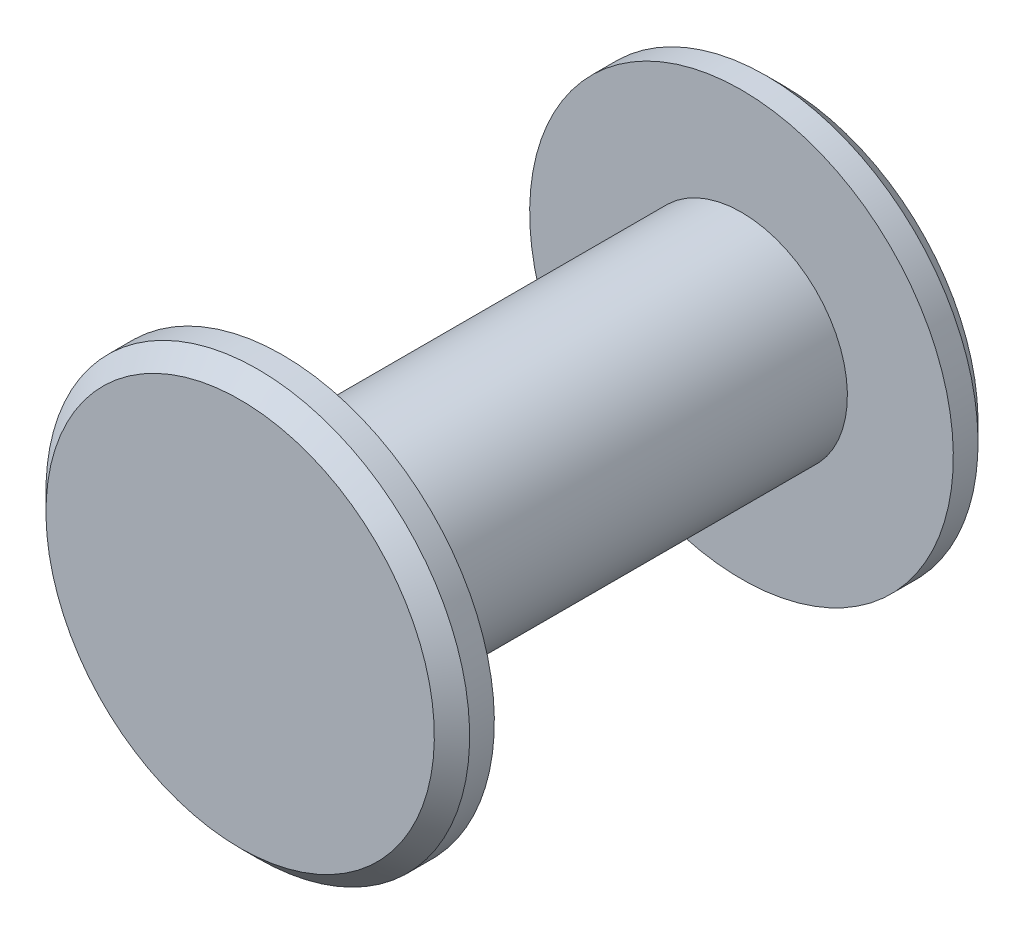
ISO-10303-21;
HEADER;
FILE_DESCRIPTION(('STEP AP214'),'2;1');
FILE_NAME('part.step','',(''),(''),'','','');
FILE_SCHEMA(('AUTOMOTIVE_DESIGN { 1 0 10303 214 1 1 1 1 }'));
ENDSEC;
DATA;
#1=APPLICATION_CONTEXT('core data for automotive mechanical design processes');
#2=APPLICATION_PROTOCOL_DEFINITION('international standard','automotive_design',2000,#1);
#3=PRODUCT_CONTEXT('',#1,'mechanical');
#4=PRODUCT('Part','Part','',(#3));
#5=PRODUCT_RELATED_PRODUCT_CATEGORY('part','',(#4));
#6=PRODUCT_DEFINITION_FORMATION('','',#4);
#7=PRODUCT_DEFINITION_CONTEXT('part definition',#1,'design');
#8=PRODUCT_DEFINITION('design','',#6,#7);
#9=PRODUCT_DEFINITION_SHAPE('','',#8);
#10=(LENGTH_UNIT() NAMED_UNIT(*) SI_UNIT(.MILLI.,.METRE.));
#11=(NAMED_UNIT(*) PLANE_ANGLE_UNIT() SI_UNIT($,.RADIAN.));
#12=(NAMED_UNIT(*) SI_UNIT($,.STERADIAN.) SOLID_ANGLE_UNIT());
#13=UNCERTAINTY_MEASURE_WITH_UNIT(LENGTH_MEASURE(1.E-05),#10,'distance_accuracy_value','');
#14=(GEOMETRIC_REPRESENTATION_CONTEXT(3) GLOBAL_UNCERTAINTY_ASSIGNED_CONTEXT((#13)) GLOBAL_UNIT_ASSIGNED_CONTEXT((#10,
#11,#12)) REPRESENTATION_CONTEXT('',''));
#15=CARTESIAN_POINT('',(0.,0.,0.));
#16=DIRECTION('',(0.,0.,1.));
#17=DIRECTION('',(1.,0.,0.));
#18=AXIS2_PLACEMENT_3D('',#15,#16,#17);
#19=CARTESIAN_POINT('',(0.,0.,0.));
#20=DIRECTION('',(0.,0.,1.));
#21=DIRECTION('',(0.,-1.,0.));
#22=AXIS2_PLACEMENT_3D('',#19,#20,#21);
#23=PLANE('',#22);
#24=CARTESIAN_POINT('',(0.,0.,0.));
#25=DIRECTION('',(0.,0.,1.));
#26=DIRECTION('',(0.,-1.,0.));
#27=AXIS2_PLACEMENT_3D('',#24,#25,#26);
#28=CIRCLE('',#27,2.75);
#29=CARTESIAN_POINT('',(0.,-2.75,0.));
#30=VERTEX_POINT('',#29);
#31=EDGE_CURVE('E12',#30,#30,#28,.T.);
#32=ORIENTED_EDGE('',*,*,#31,.T.);
#33=EDGE_LOOP('',(#32));
#34=FACE_BOUND('',#33,.T.);
#35=ADVANCED_FACE('F60',(#34),#23,.T.);
#36=CARTESIAN_POINT('',(0.,0.,0.));
#37=DIRECTION('',(0.,0.,-1.));
#38=DIRECTION('',(0.,1.,0.));
#39=AXIS2_PLACEMENT_3D('',#36,#37,#38);
#40=CYLINDRICAL_SURFACE('',#39,3.);
#41=CARTESIAN_POINT('',(0.,0.,-0.249999999999999));
#42=DIRECTION('',(0.,0.,1.));
#43=DIRECTION('',(0.,-1.,0.));
#44=AXIS2_PLACEMENT_3D('',#41,#42,#43);
#45=CIRCLE('',#44,3.);
#46=CARTESIAN_POINT('',(0.,-3.,-0.25));
#47=VERTEX_POINT('',#46);
#48=EDGE_CURVE('E69',#47,#47,#45,.F.);
#49=ORIENTED_EDGE('',*,*,#48,.T.);
#50=EDGE_LOOP('',(#49));
#51=FACE_BOUND('',#50,.T.);
#52=CARTESIAN_POINT('',(0.,0.,-0.6));
#53=DIRECTION('',(0.,0.,-1.));
#54=DIRECTION('',(0.,1.,0.));
#55=AXIS2_PLACEMENT_3D('',#52,#53,#54);
#56=CIRCLE('',#55,3.);
#57=CARTESIAN_POINT('',(0.,3.,-0.6));
#58=VERTEX_POINT('',#57);
#59=EDGE_CURVE('E87',#58,#58,#56,.T.);
#60=ORIENTED_EDGE('',*,*,#59,.F.);
#61=EDGE_LOOP('',(#60));
#62=FACE_BOUND('',#61,.T.);
#63=ADVANCED_FACE('F123',(#51,#62),#40,.T.);
#64=CARTESIAN_POINT('',(0.,3.,-0.6));
#65=DIRECTION('',(0.,0.,-1.));
#66=DIRECTION('',(0.,1.,0.));
#67=AXIS2_PLACEMENT_3D('',#64,#65,#66);
#68=PLANE('',#67);
#69=ORIENTED_EDGE('',*,*,#59,.T.);
#70=EDGE_LOOP('',(#69));
#71=FACE_BOUND('',#70,.T.);
#72=CARTESIAN_POINT('',(0.,0.,-0.6));
#73=DIRECTION('',(0.,0.,-1.));
#74=DIRECTION('',(0.,1.,0.));
#75=AXIS2_PLACEMENT_3D('',#72,#73,#74);
#76=CIRCLE('',#75,1.5);
#77=CARTESIAN_POINT('',(0.,1.5,-0.6));
#78=VERTEX_POINT('',#77);
#79=EDGE_CURVE('E91',#78,#78,#76,.T.);
#80=ORIENTED_EDGE('',*,*,#79,.F.);
#81=EDGE_LOOP('',(#80));
#82=FACE_BOUND('',#81,.T.);
#83=ADVANCED_FACE('F119',(#71,#82),#68,.T.);
#84=CARTESIAN_POINT('',(0.,0.,0.));
#85=DIRECTION('',(0.,0.,-1.));
#86=DIRECTION('',(0.,1.,0.));
#87=AXIS2_PLACEMENT_3D('',#84,#85,#86);
#88=CYLINDRICAL_SURFACE('',#87,1.5);
#89=ORIENTED_EDGE('',*,*,#79,.T.);
#90=EDGE_LOOP('',(#89));
#91=FACE_BOUND('',#90,.T.);
#92=CARTESIAN_POINT('',(0.,0.,-7.1));
#93=DIRECTION('',(0.,0.,-1.));
#94=DIRECTION('',(0.,1.,0.));
#95=AXIS2_PLACEMENT_3D('',#92,#93,#94);
#96=CIRCLE('',#95,1.5);
#97=CARTESIAN_POINT('',(0.,1.5,-7.1));
#98=VERTEX_POINT('',#97);
#99=EDGE_CURVE('E95',#98,#98,#96,.T.);
#100=ORIENTED_EDGE('',*,*,#99,.F.);
#101=EDGE_LOOP('',(#100));
#102=FACE_BOUND('',#101,.T.);
#103=ADVANCED_FACE('F109',(#91,#102),#88,.T.);
#104=CARTESIAN_POINT('',(0.,1.5,-7.1));
#105=DIRECTION('',(0.,0.,1.));
#106=DIRECTION('',(0.,-1.,0.));
#107=AXIS2_PLACEMENT_3D('',#104,#105,#106);
#108=PLANE('',#107);
#109=ORIENTED_EDGE('',*,*,#99,.T.);
#110=EDGE_LOOP('',(#109));
#111=FACE_BOUND('',#110,.T.);
#112=CARTESIAN_POINT('',(0.,0.,-7.1));
#113=DIRECTION('',(0.,0.,-1.));
#114=DIRECTION('',(0.,1.,0.));
#115=AXIS2_PLACEMENT_3D('',#112,#113,#114);
#116=CIRCLE('',#115,3.);
#117=CARTESIAN_POINT('',(0.,3.,-7.1));
#118=VERTEX_POINT('',#117);
#119=EDGE_CURVE('E99',#118,#118,#116,.T.);
#120=ORIENTED_EDGE('',*,*,#119,.F.);
#121=EDGE_LOOP('',(#120));
#122=FACE_BOUND('',#121,.T.);
#123=ADVANCED_FACE('F107',(#111,#122),#108,.T.);
#124=CARTESIAN_POINT('',(0.,0.,0.));
#125=DIRECTION('',(0.,0.,-1.));
#126=DIRECTION('',(0.,1.,0.));
#127=AXIS2_PLACEMENT_3D('',#124,#125,#126);
#128=CYLINDRICAL_SURFACE('',#127,3.);
#129=CARTESIAN_POINT('',(0.,0.,-7.45));
#130=DIRECTION('',(0.,0.,-1.));
#131=DIRECTION('',(0.,1.,0.));
#132=AXIS2_PLACEMENT_3D('',#129,#130,#131);
#133=CIRCLE('',#132,3.);
#134=CARTESIAN_POINT('',(0.,3.,-7.45));
#135=VERTEX_POINT('',#134);
#136=EDGE_CURVE('E75',#135,#135,#133,.F.);
#137=ORIENTED_EDGE('',*,*,#136,.T.);
#138=EDGE_LOOP('',(#137));
#139=FACE_BOUND('',#138,.T.);
#140=ORIENTED_EDGE('',*,*,#119,.T.);
#141=EDGE_LOOP('',(#140));
#142=FACE_BOUND('',#141,.T.);
#143=ADVANCED_FACE('F105',(#139,#142),#128,.T.);
#144=CARTESIAN_POINT('',(0.,3.,-7.7));
#145=DIRECTION('',(0.,0.,-1.));
#146=DIRECTION('',(0.,1.,0.));
#147=AXIS2_PLACEMENT_3D('',#144,#145,#146);
#148=PLANE('',#147);
#149=CARTESIAN_POINT('',(0.,0.,-7.7));
#150=DIRECTION('',(0.,0.,-1.));
#151=DIRECTION('',(0.,1.,0.));
#152=AXIS2_PLACEMENT_3D('',#149,#150,#151);
#153=CIRCLE('',#152,2.75);
#154=CARTESIAN_POINT('',(0.,2.75,-7.7));
#155=VERTEX_POINT('',#154);
#156=EDGE_CURVE('E81',#155,#155,#153,.T.);
#157=ORIENTED_EDGE('',*,*,#156,.T.);
#158=EDGE_LOOP('',(#157));
#159=FACE_BOUND('',#158,.T.);
#160=ADVANCED_FACE('F116',(#159),#148,.T.);
#161=CARTESIAN_POINT('',(0.,0.,-7.7));
#162=DIRECTION('',(0.,0.,1.));
#163=DIRECTION('',(0.,-1.,0.));
#164=AXIS2_PLACEMENT_3D('',#161,#162,#163);
#165=CONICAL_SURFACE('',#164,2.75,0.785398163397449);
#166=ORIENTED_EDGE('',*,*,#136,.F.);
#167=EDGE_LOOP('',(#166));
#168=FACE_BOUND('',#167,.T.);
#169=ORIENTED_EDGE('',*,*,#156,.F.);
#170=EDGE_LOOP('',(#169));
#171=FACE_BOUND('',#170,.T.);
#172=ADVANCED_FACE('F131',(#168,#171),#165,.T.);
#173=CARTESIAN_POINT('',(0.,0.,-0.249999999999999));
#174=DIRECTION('',(0.,0.,-1.));
#175=DIRECTION('',(0.,1.,0.));
#176=AXIS2_PLACEMENT_3D('',#173,#174,#175);
#177=CONICAL_SURFACE('',#176,3.,0.785398163397451);
#178=ORIENTED_EDGE('',*,*,#31,.F.);
#179=EDGE_LOOP('',(#178));
#180=FACE_BOUND('',#179,.T.);
#181=ORIENTED_EDGE('',*,*,#48,.F.);
#182=EDGE_LOOP('',(#181));
#183=FACE_BOUND('',#182,.T.);
#184=ADVANCED_FACE('F63',(#180,#183),#177,.T.);
#185=CLOSED_SHELL('',(#35,#63,#83,#103,#123,#143,#160,#172,#184));
#186=MANIFOLD_SOLID_BREP('B2',#185);
#187=ADVANCED_BREP_SHAPE_REPRESENTATION('',(#18,#186),#14);
#188=SHAPE_DEFINITION_REPRESENTATION(#9,#187);
ENDSEC;
END-ISO-10303-21;
